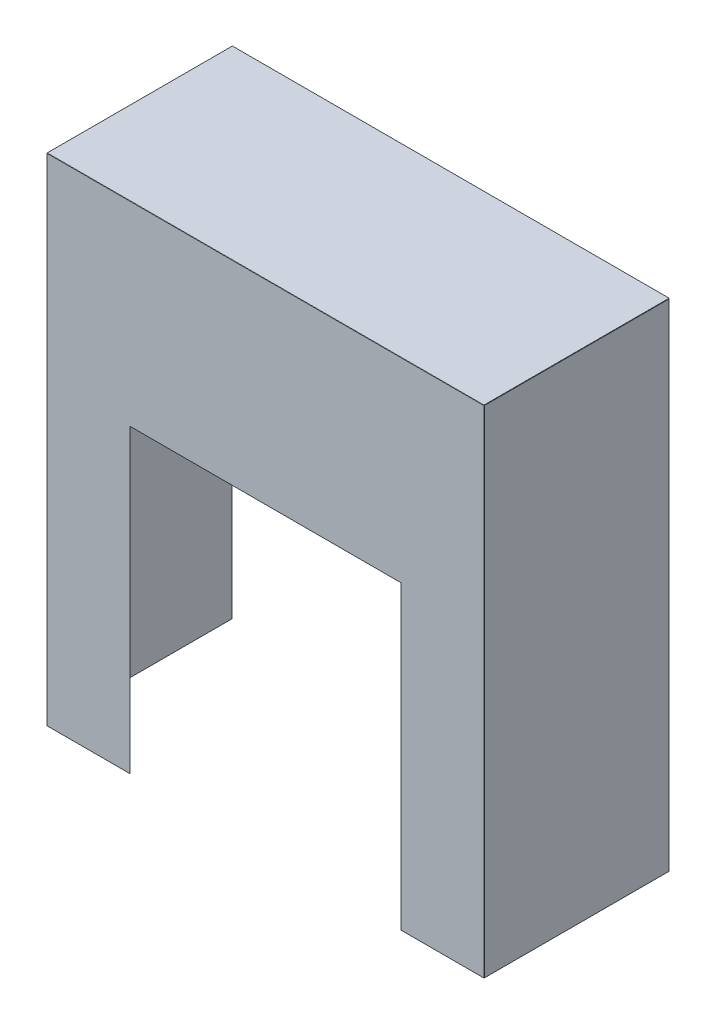
ISO-10303-21;
HEADER;
FILE_DESCRIPTION(('STEP AP214'),'2;1');
FILE_NAME('part.step','',(''),(''),'','','');
FILE_SCHEMA(('AUTOMOTIVE_DESIGN { 1 0 10303 214 1 1 1 1 }'));
ENDSEC;
DATA;
#1=APPLICATION_CONTEXT('core data for automotive mechanical design processes');
#2=APPLICATION_PROTOCOL_DEFINITION('international standard','automotive_design',2000,#1);
#3=PRODUCT_CONTEXT('',#1,'mechanical');
#4=PRODUCT('Part','Part','',(#3));
#5=PRODUCT_RELATED_PRODUCT_CATEGORY('part','',(#4));
#6=PRODUCT_DEFINITION_FORMATION('','',#4);
#7=PRODUCT_DEFINITION_CONTEXT('part definition',#1,'design');
#8=PRODUCT_DEFINITION('design','',#6,#7);
#9=PRODUCT_DEFINITION_SHAPE('','',#8);
#10=(LENGTH_UNIT() NAMED_UNIT(*) SI_UNIT(.MILLI.,.METRE.));
#11=(NAMED_UNIT(*) PLANE_ANGLE_UNIT() SI_UNIT($,.RADIAN.));
#12=(NAMED_UNIT(*) SI_UNIT($,.STERADIAN.) SOLID_ANGLE_UNIT());
#13=UNCERTAINTY_MEASURE_WITH_UNIT(LENGTH_MEASURE(1.E-05),#10,'distance_accuracy_value','');
#14=(GEOMETRIC_REPRESENTATION_CONTEXT(3) GLOBAL_UNCERTAINTY_ASSIGNED_CONTEXT((#13)) GLOBAL_UNIT_ASSIGNED_CONTEXT((#10,
#11,#12)) REPRESENTATION_CONTEXT('',''));
#15=CARTESIAN_POINT('',(0.,0.,0.));
#16=DIRECTION('',(0.,0.,1.));
#17=DIRECTION('',(1.,0.,0.));
#18=AXIS2_PLACEMENT_3D('',#15,#16,#17);
#19=CARTESIAN_POINT('',(-2950.,-3350.,2.00660000001204));
#20=DIRECTION('',(0.,-1.,0.));
#21=DIRECTION('',(0.,0.,-1.));
#22=AXIS2_PLACEMENT_3D('',#19,#20,#21);
#23=PLANE('',#22);
#24=DIRECTION('',(0.,0.,1.));
#25=VECTOR('',#24,1.);
#26=CARTESIAN_POINT('',(-560.599999999999,-3350.,-1250.001));
#27=LINE('',#26,#25);
#28=CARTESIAN_POINT('',(-560.599999999999,-3350.,0.736600000011745));
#29=VERTEX_POINT('',#28);
#30=CARTESIAN_POINT('',(-560.599999999999,-3350.,2.00659999999999));
#31=VERTEX_POINT('',#30);
#32=EDGE_CURVE('E403',#29,#31,#27,.T.);
#33=ORIENTED_EDGE('',*,*,#32,.F.);
#34=DIRECTION('',(1.,0.,0.));
#35=VECTOR('',#34,1.);
#36=CARTESIAN_POINT('',(0.,-3350.,0.736600000011689));
#37=LINE('',#36,#35);
#38=CARTESIAN_POINT('',(0.,-3350.,0.736600000011689));
#39=VERTEX_POINT('',#38);
#40=EDGE_CURVE('E244',#39,#29,#37,.F.);
#41=ORIENTED_EDGE('',*,*,#40,.F.);
#42=DIRECTION('',(0.,0.,-1.));
#43=VECTOR('',#42,1.);
#44=CARTESIAN_POINT('',(0.,-3350.,2.00660000001169));
#45=LINE('',#44,#43);
#46=CARTESIAN_POINT('',(2.12629513171861E-13,-3350.,2.00660000001157));
#47=VERTEX_POINT('',#46);
#48=EDGE_CURVE('E265',#47,#39,#45,.T.);
#49=ORIENTED_EDGE('',*,*,#48,.F.);
#50=DIRECTION('',(-1.,0.,0.));
#51=VECTOR('',#50,1.);
#52=CARTESIAN_POINT('',(-2950.,-3350.,2.00660000001204));
#53=LINE('',#52,#51);
#54=EDGE_CURVE('E257',#47,#31,#53,.T.);
#55=ORIENTED_EDGE('',*,*,#54,.T.);
#56=EDGE_LOOP('',(#33,#41,#49,#55));
#57=FACE_BOUND('',#56,.T.);
#58=ADVANCED_FACE('F102',(#57),#23,.T.);
#59=CARTESIAN_POINT('',(0.,-1.27,0.));
#60=DIRECTION('',(1.,0.,0.));
#61=DIRECTION('',(0.,0.,-1.));
#62=AXIS2_PLACEMENT_3D('',#59,#60,#61);
#63=PLANE('',#62);
#64=DIRECTION('',(0.,0.,-1.));
#65=VECTOR('',#64,1.);
#66=CARTESIAN_POINT('',(0.,0.,0.));
#67=LINE('',#66,#65);
#68=CARTESIAN_POINT('',(0.,0.,0.));
#69=VERTEX_POINT('',#68);
#70=CARTESIAN_POINT('',(0.,0.,-1250.));
#71=VERTEX_POINT('',#70);
#72=EDGE_CURVE('E159',#69,#71,#67,.T.);
#73=ORIENTED_EDGE('',*,*,#72,.F.);
#74=DIRECTION('',(0.,1.,0.));
#75=VECTOR('',#74,1.);
#76=CARTESIAN_POINT('',(0.,-1.27,0.));
#77=LINE('',#76,#75);
#78=CARTESIAN_POINT('',(0.,-1.2699999999998,-2.9610493025748E-13));
#79=VERTEX_POINT('',#78);
#80=EDGE_CURVE('E13',#79,#69,#77,.T.);
#81=ORIENTED_EDGE('',*,*,#80,.F.);
#82=DIRECTION('',(0.,0.,-1.));
#83=VECTOR('',#82,1.);
#84=CARTESIAN_POINT('',(0.,-1.27,0.));
#85=LINE('',#84,#83);
#86=CARTESIAN_POINT('',(0.,-1.27,-1250.));
#87=VERTEX_POINT('',#86);
#88=EDGE_CURVE('E183',#79,#87,#85,.T.);
#89=ORIENTED_EDGE('',*,*,#88,.T.);
#90=DIRECTION('',(0.,1.,0.));
#91=VECTOR('',#90,1.);
#92=CARTESIAN_POINT('',(0.,-1.27,-1250.));
#93=LINE('',#92,#91);
#94=EDGE_CURVE('E106',#87,#71,#93,.T.);
#95=ORIENTED_EDGE('',*,*,#94,.T.);
#96=EDGE_LOOP('',(#73,#81,#89,#95));
#97=FACE_BOUND('',#96,.T.);
#98=ADVANCED_FACE('F104',(#97),#63,.T.);
#99=CARTESIAN_POINT('',(-2950.,-1.27,3.55147571752732E-13));
#100=DIRECTION('',(-1.,0.,0.));
#101=DIRECTION('',(0.,0.,1.));
#102=AXIS2_PLACEMENT_3D('',#99,#100,#101);
#103=PLANE('',#102);
#104=DIRECTION('',(0.,0.,1.));
#105=VECTOR('',#104,1.);
#106=CARTESIAN_POINT('',(-2950.,0.,3.55147571752732E-13));
#107=LINE('',#106,#105);
#108=CARTESIAN_POINT('',(-2950.,0.,-1250.));
#109=VERTEX_POINT('',#108);
#110=CARTESIAN_POINT('',(-2950.,2.05131051034257E-13,0.));
#111=VERTEX_POINT('',#110);
#112=EDGE_CURVE('E181',#109,#111,#107,.T.);
#113=ORIENTED_EDGE('',*,*,#112,.F.);
#114=DIRECTION('',(0.,1.,0.));
#115=VECTOR('',#114,1.);
#116=CARTESIAN_POINT('',(-2950.,-1.27,-1250.));
#117=LINE('',#116,#115);
#118=CARTESIAN_POINT('',(-2950.,-1.27,-1250.));
#119=VERTEX_POINT('',#118);
#120=EDGE_CURVE('E129',#119,#109,#117,.T.);
#121=ORIENTED_EDGE('',*,*,#120,.F.);
#122=DIRECTION('',(0.,0.,1.));
#123=VECTOR('',#122,1.);
#124=CARTESIAN_POINT('',(-2950.,-1.27,3.55147571752732E-13));
#125=LINE('',#124,#123);
#126=CARTESIAN_POINT('',(-2950.,-1.2699999999998,3.55211199697517E-13));
#127=VERTEX_POINT('',#126);
#128=EDGE_CURVE('E201',#119,#127,#125,.T.);
#129=ORIENTED_EDGE('',*,*,#128,.T.);
#130=DIRECTION('',(0.,1.,0.));
#131=VECTOR('',#130,1.);
#132=CARTESIAN_POINT('',(-2950.,-1.27,3.55147571752732E-13));
#133=LINE('',#132,#131);
#134=EDGE_CURVE('E112',#127,#111,#133,.T.);
#135=ORIENTED_EDGE('',*,*,#134,.T.);
#136=EDGE_LOOP('',(#113,#121,#129,#135));
#137=FACE_BOUND('',#136,.T.);
#138=ADVANCED_FACE('F613',(#137),#103,.T.);
#139=CARTESIAN_POINT('',(0.,-1.27,-1250.));
#140=DIRECTION('',(0.,0.,-1.));
#141=DIRECTION('',(-1.,0.,0.));
#142=AXIS2_PLACEMENT_3D('',#139,#140,#141);
#143=PLANE('',#142);
#144=DIRECTION('',(-1.,0.,0.));
#145=VECTOR('',#144,1.);
#146=CARTESIAN_POINT('',(0.,0.,-1250.));
#147=LINE('',#146,#145);
#148=EDGE_CURVE('E177',#71,#109,#147,.T.);
#149=ORIENTED_EDGE('',*,*,#148,.F.);
#150=ORIENTED_EDGE('',*,*,#94,.F.);
#151=DIRECTION('',(-1.,0.,0.));
#152=VECTOR('',#151,1.);
#153=CARTESIAN_POINT('',(0.,-1.27,-1250.));
#154=LINE('',#153,#152);
#155=EDGE_CURVE('E187',#87,#119,#154,.T.);
#156=ORIENTED_EDGE('',*,*,#155,.T.);
#157=ORIENTED_EDGE('',*,*,#120,.T.);
#158=EDGE_LOOP('',(#149,#150,#156,#157));
#159=FACE_BOUND('',#158,.T.);
#160=ADVANCED_FACE('F210',(#159),#143,.T.);
#161=CARTESIAN_POINT('',(0.,-1.27,0.));
#162=DIRECTION('',(0.,1.,0.));
#163=DIRECTION('',(0.,0.,1.));
#164=AXIS2_PLACEMENT_3D('',#161,#162,#163);
#165=PLANE('',#164);
#166=ORIENTED_EDGE('',*,*,#88,.F.);
#167=DIRECTION('',(1.,0.,0.));
#168=VECTOR('',#167,1.);
#169=CARTESIAN_POINT('',(0.,-1.27,0.));
#170=LINE('',#169,#168);
#171=EDGE_CURVE('E198',#127,#79,#170,.T.);
#172=ORIENTED_EDGE('',*,*,#171,.F.);
#173=ORIENTED_EDGE('',*,*,#128,.F.);
#174=ORIENTED_EDGE('',*,*,#155,.F.);
#175=EDGE_LOOP('',(#166,#172,#173,#174));
#176=FACE_BOUND('',#175,.T.);
#177=ADVANCED_FACE('F213',(#176),#165,.F.);
#178=CARTESIAN_POINT('',(0.,0.,0.));
#179=DIRECTION('',(0.,1.,0.));
#180=DIRECTION('',(0.,0.,1.));
#181=AXIS2_PLACEMENT_3D('',#178,#179,#180);
#182=PLANE('',#181);
#183=ORIENTED_EDGE('',*,*,#72,.T.);
#184=ORIENTED_EDGE('',*,*,#148,.T.);
#185=ORIENTED_EDGE('',*,*,#112,.T.);
#186=DIRECTION('',(1.,0.,0.));
#187=VECTOR('',#186,1.);
#188=CARTESIAN_POINT('',(0.,0.,0.));
#189=LINE('',#188,#187);
#190=EDGE_CURVE('E150',#111,#69,#189,.T.);
#191=ORIENTED_EDGE('',*,*,#190,.T.);
#192=EDGE_LOOP('',(#183,#184,#185,#191));
#193=FACE_BOUND('',#192,.T.);
#194=ADVANCED_FACE('F180',(#193),#182,.T.);
#195=CARTESIAN_POINT('',(0.,-2.00659999999994,-1.48011539015749E-13));
#196=DIRECTION('',(1.,0.,0.));
#197=DIRECTION('',(0.,0.,-1.));
#198=AXIS2_PLACEMENT_3D('',#195,#196,#197);
#199=PLANE('',#198);
#200=DIRECTION('',(0.,0.,1.));
#201=VECTOR('',#200,1.);
#202=CARTESIAN_POINT('',(0.,-2.00660000000008,2.00660000001169));
#203=LINE('',#202,#201);
#204=CARTESIAN_POINT('',(0.,-2.00659999999994,0.7366));
#205=VERTEX_POINT('',#204);
#206=CARTESIAN_POINT('',(0.,-2.00659999999994,2.0066));
#207=VERTEX_POINT('',#206);
#208=EDGE_CURVE('E224',#205,#207,#203,.T.);
#209=ORIENTED_EDGE('',*,*,#208,.F.);
#210=CARTESIAN_POINT('',(0.,-2.00659999999994,-1.48011539015749E-13));
#211=DIRECTION('',(-1.,0.,0.));
#212=DIRECTION('',(0.,0.,1.));
#213=AXIS2_PLACEMENT_3D('',#210,#211,#212);
#214=CIRCLE('',#213,0.736600000000148);
#215=EDGE_CURVE('E168',#79,#205,#214,.F.);
#216=ORIENTED_EDGE('',*,*,#215,.F.);
#217=ORIENTED_EDGE('',*,*,#80,.T.);
#218=CARTESIAN_POINT('',(0.,-2.00659999999994,-1.48011539015749E-13));
#219=DIRECTION('',(-1.,0.,0.));
#220=DIRECTION('',(0.,0.,1.));
#221=AXIS2_PLACEMENT_3D('',#218,#219,#220);
#222=CIRCLE('',#221,2.00660000000015);
#223=EDGE_CURVE('E146',#69,#207,#222,.F.);
#224=ORIENTED_EDGE('',*,*,#223,.T.);
#225=EDGE_LOOP('',(#209,#216,#217,#224));
#226=FACE_BOUND('',#225,.T.);
#227=ADVANCED_FACE('F165',(#226),#199,.T.);
#228=CARTESIAN_POINT('',(-2950.,-2.00659999999994,5.03304590939249E-13));
#229=DIRECTION('',(1.,0.,0.));
#230=DIRECTION('',(0.,0.,-1.));
#231=AXIS2_PLACEMENT_3D('',#228,#229,#230);
#232=PLANE('',#231);
#233=CARTESIAN_POINT('',(-2950.,-2.00659999999994,5.03304590939249E-13));
#234=DIRECTION('',(-1.,0.,0.));
#235=DIRECTION('',(0.,0.,1.));
#236=AXIS2_PLACEMENT_3D('',#233,#234,#235);
#237=CIRCLE('',#236,0.736600000000148);
#238=CARTESIAN_POINT('',(-2950.,-2.00659999999994,0.736600000000651));
#239=VERTEX_POINT('',#238);
#240=EDGE_CURVE('E216',#239,#127,#237,.T.);
#241=ORIENTED_EDGE('',*,*,#240,.F.);
#242=DIRECTION('',(0.,0.,1.));
#243=VECTOR('',#242,1.);
#244=CARTESIAN_POINT('',(-2950.,-2.00659999999989,0.736600000000355));
#245=LINE('',#244,#243);
#246=CARTESIAN_POINT('',(-2950.,-2.00660000000004,2.00660000000064));
#247=VERTEX_POINT('',#246);
#248=EDGE_CURVE('E233',#239,#247,#245,.T.);
#249=ORIENTED_EDGE('',*,*,#248,.T.);
#250=CARTESIAN_POINT('',(-2950.,-2.00659999999994,5.03304590939249E-13));
#251=DIRECTION('',(-1.,0.,0.));
#252=DIRECTION('',(0.,0.,1.));
#253=AXIS2_PLACEMENT_3D('',#250,#251,#252);
#254=CIRCLE('',#253,2.00660000000015);
#255=EDGE_CURVE('E160',#247,#111,#254,.T.);
#256=ORIENTED_EDGE('',*,*,#255,.T.);
#257=ORIENTED_EDGE('',*,*,#134,.F.);
#258=EDGE_LOOP('',(#241,#249,#256,#257));
#259=FACE_BOUND('',#258,.T.);
#260=ADVANCED_FACE('F525',(#259),#232,.F.);
#261=CARTESIAN_POINT('',(-2950.,-2.00659999999994,5.03304590939249E-13));
#262=DIRECTION('',(-1.,0.,0.));
#263=DIRECTION('',(0.,0.,1.));
#264=AXIS2_PLACEMENT_3D('',#261,#262,#263);
#265=CYLINDRICAL_SURFACE('',#264,2.00660000000015);
#266=ORIENTED_EDGE('',*,*,#190,.F.);
#267=ORIENTED_EDGE('',*,*,#255,.F.);
#268=DIRECTION('',(-1.,0.,0.));
#269=VECTOR('',#268,1.);
#270=CARTESIAN_POINT('',(0.,-2.0066,2.0066));
#271=LINE('',#270,#269);
#272=EDGE_CURVE('E154',#207,#247,#271,.T.);
#273=ORIENTED_EDGE('',*,*,#272,.F.);
#274=ORIENTED_EDGE('',*,*,#223,.F.);
#275=EDGE_LOOP('',(#266,#267,#273,#274));
#276=FACE_BOUND('',#275,.T.);
#277=ADVANCED_FACE('F147',(#276),#265,.T.);
#278=CARTESIAN_POINT('',(-2950.,-2.00659999999994,5.03304590939249E-13));
#279=DIRECTION('',(-1.,0.,0.));
#280=DIRECTION('',(0.,0.,1.));
#281=AXIS2_PLACEMENT_3D('',#278,#279,#280);
#282=CYLINDRICAL_SURFACE('',#281,0.736600000000148);
#283=ORIENTED_EDGE('',*,*,#171,.T.);
#284=ORIENTED_EDGE('',*,*,#215,.T.);
#285=DIRECTION('',(1.,0.,0.));
#286=VECTOR('',#285,1.);
#287=CARTESIAN_POINT('',(0.,-2.0066,0.7366));
#288=LINE('',#287,#286);
#289=EDGE_CURVE('E228',#205,#239,#288,.F.);
#290=ORIENTED_EDGE('',*,*,#289,.T.);
#291=ORIENTED_EDGE('',*,*,#240,.T.);
#292=EDGE_LOOP('',(#283,#284,#290,#291));
#293=FACE_BOUND('',#292,.T.);
#294=ADVANCED_FACE('F522',(#293),#282,.F.);
#295=CARTESIAN_POINT('',(0.,0.,2.00659999999999));
#296=DIRECTION('',(0.,0.,1.));
#297=DIRECTION('',(0.,-1.,0.));
#298=AXIS2_PLACEMENT_3D('',#295,#296,#297);
#299=PLANE('',#298);
#300=DIRECTION('',(0.,1.,0.));
#301=VECTOR('',#300,1.);
#302=CARTESIAN_POINT('',(-560.599999999999,-3350.,2.00659999999999));
#303=LINE('',#302,#301);
#304=CARTESIAN_POINT('',(-560.6,-1318.,2.00659999999999));
#305=VERTEX_POINT('',#304);
#306=EDGE_CURVE('E423',#31,#305,#303,.T.);
#307=ORIENTED_EDGE('',*,*,#306,.F.);
#308=ORIENTED_EDGE('',*,*,#54,.F.);
#309=DIRECTION('',(0.,-1.,0.));
#310=VECTOR('',#309,1.);
#311=CARTESIAN_POINT('',(0.,-3350.,2.00660000001169));
#312=LINE('',#311,#310);
#313=EDGE_CURVE('E252',#207,#47,#312,.T.);
#314=ORIENTED_EDGE('',*,*,#313,.F.);
#315=ORIENTED_EDGE('',*,*,#272,.T.);
#316=DIRECTION('',(0.,1.,0.));
#317=VECTOR('',#316,1.);
#318=CARTESIAN_POINT('',(-2950.,-1.27,2.00660000000035));
#319=LINE('',#318,#317);
#320=CARTESIAN_POINT('',(-2950.,-3350.,2.00660000001204));
#321=VERTEX_POINT('',#320);
#322=EDGE_CURVE('E261',#321,#247,#319,.T.);
#323=ORIENTED_EDGE('',*,*,#322,.F.);
#324=CARTESIAN_POINT('',(-2389.4,-3350.,2.00660000001198));
#325=VERTEX_POINT('',#324);
#326=EDGE_CURVE('E256',#325,#321,#53,.T.);
#327=ORIENTED_EDGE('',*,*,#326,.F.);
#328=DIRECTION('',(0.,-1.,0.));
#329=VECTOR('',#328,1.);
#330=CARTESIAN_POINT('',(-2389.4,-3350.,2.00659999999999));
#331=LINE('',#330,#329);
#332=CARTESIAN_POINT('',(-2389.4,-1318.,2.00659999999999));
#333=VERTEX_POINT('',#332);
#334=EDGE_CURVE('E120',#333,#325,#331,.T.);
#335=ORIENTED_EDGE('',*,*,#334,.F.);
#336=DIRECTION('',(-1.,0.,0.));
#337=VECTOR('',#336,1.);
#338=CARTESIAN_POINT('',(-560.6,-1318.,2.00659999999999));
#339=LINE('',#338,#337);
#340=EDGE_CURVE('E419',#305,#333,#339,.T.);
#341=ORIENTED_EDGE('',*,*,#340,.F.);
#342=EDGE_LOOP('',(#307,#308,#314,#315,#323,#327,#335,#341));
#343=FACE_BOUND('',#342,.T.);
#344=ADVANCED_FACE('F567',(#343),#299,.T.);
#345=CARTESIAN_POINT('',(0.,0.,0.736599999999993));
#346=DIRECTION('',(0.,0.,1.));
#347=DIRECTION('',(0.,-1.,0.));
#348=AXIS2_PLACEMENT_3D('',#345,#346,#347);
#349=PLANE('',#348);
#350=ORIENTED_EDGE('',*,*,#40,.T.);
#351=DIRECTION('',(0.,-1.,0.));
#352=VECTOR('',#351,1.);
#353=CARTESIAN_POINT('',(-560.599999999999,-3349.99999999999,0.736600000011745));
#354=LINE('',#353,#352);
#355=CARTESIAN_POINT('',(-560.6,-1318.,0.736600000004639));
#356=VERTEX_POINT('',#355);
#357=EDGE_CURVE('E427',#356,#29,#354,.T.);
#358=ORIENTED_EDGE('',*,*,#357,.F.);
#359=DIRECTION('',(1.,0.,0.));
#360=VECTOR('',#359,1.);
#361=CARTESIAN_POINT('',(-560.6,-1318.,0.736600000004639));
#362=LINE('',#361,#360);
#363=CARTESIAN_POINT('',(-2389.4,-1318.,0.736600000004639));
#364=VERTEX_POINT('',#363);
#365=EDGE_CURVE('E357',#364,#356,#362,.T.);
#366=ORIENTED_EDGE('',*,*,#365,.F.);
#367=DIRECTION('',(0.,1.,0.));
#368=VECTOR('',#367,1.);
#369=CARTESIAN_POINT('',(-2389.4,-3349.99999999999,0.736600000011967));
#370=LINE('',#369,#368);
#371=CARTESIAN_POINT('',(-2389.4,-3350.,0.736600000011522));
#372=VERTEX_POINT('',#371);
#373=EDGE_CURVE('E431',#372,#364,#370,.T.);
#374=ORIENTED_EDGE('',*,*,#373,.F.);
#375=CARTESIAN_POINT('',(-2950.,-3350.,0.736600000012045));
#376=VERTEX_POINT('',#375);
#377=EDGE_CURVE('E243',#372,#376,#37,.F.);
#378=ORIENTED_EDGE('',*,*,#377,.T.);
#379=DIRECTION('',(0.,-1.,0.));
#380=VECTOR('',#379,1.);
#381=CARTESIAN_POINT('',(-2950.,0.,0.736600000000348));
#382=LINE('',#381,#380);
#383=EDGE_CURVE('E248',#376,#239,#382,.F.);
#384=ORIENTED_EDGE('',*,*,#383,.T.);
#385=ORIENTED_EDGE('',*,*,#289,.F.);
#386=DIRECTION('',(0.,1.,0.));
#387=VECTOR('',#386,1.);
#388=CARTESIAN_POINT('',(0.,0.,0.736599999999993));
#389=LINE('',#388,#387);
#390=EDGE_CURVE('E239',#205,#39,#389,.F.);
#391=ORIENTED_EDGE('',*,*,#390,.T.);
#392=EDGE_LOOP('',(#350,#358,#366,#374,#378,#384,#385,#391));
#393=FACE_BOUND('',#392,.T.);
#394=ADVANCED_FACE('F447',(#393),#349,.F.);
#395=DIRECTION('',(0.,0.,1.));
#396=VECTOR('',#395,1.);
#397=CARTESIAN_POINT('',(-2389.4,-3350.,-1250.001));
#398=LINE('',#397,#396);
#399=EDGE_CURVE('E411',#372,#325,#398,.T.);
#400=ORIENTED_EDGE('',*,*,#399,.T.);
#401=ORIENTED_EDGE('',*,*,#326,.T.);
#402=DIRECTION('',(0.,0.,-1.));
#403=VECTOR('',#402,1.);
#404=CARTESIAN_POINT('',(-2950.,-3350.,2.00660000001204));
#405=LINE('',#404,#403);
#406=EDGE_CURVE('E219',#321,#376,#405,.T.);
#407=ORIENTED_EDGE('',*,*,#406,.T.);
#408=ORIENTED_EDGE('',*,*,#377,.F.);
#409=EDGE_LOOP('',(#400,#401,#407,#408));
#410=FACE_BOUND('',#409,.T.);
#411=ADVANCED_FACE('F561',(#410),#23,.T.);
#412=CARTESIAN_POINT('',(1.23035228679939E-13,-2.00660000000008,0.));
#413=DIRECTION('',(0.,1.,0.));
#414=DIRECTION('',(0.,0.,1.));
#415=AXIS2_PLACEMENT_3D('',#412,#413,#414);
#416=PLANE('',#415);
#417=DIRECTION('',(1.,0.,0.));
#418=VECTOR('',#417,1.);
#419=CARTESIAN_POINT('',(2.0066,-2.00659999999994,0.));
#420=LINE('',#419,#418);
#421=CARTESIAN_POINT('',(0.7366,-2.00660000000008,0.));
#422=VERTEX_POINT('',#421);
#423=CARTESIAN_POINT('',(2.0066,-2.00660000000008,0.));
#424=VERTEX_POINT('',#423);
#425=EDGE_CURVE('E288',#422,#424,#420,.T.);
#426=ORIENTED_EDGE('',*,*,#425,.F.);
#427=CARTESIAN_POINT('',(1.23035228679939E-13,-2.00660000000008,0.));
#428=DIRECTION('',(0.,-1.,0.));
#429=DIRECTION('',(0.,0.,-1.));
#430=AXIS2_PLACEMENT_3D('',#427,#428,#429);
#431=CIRCLE('',#430,0.736599999999877);
#432=EDGE_CURVE('E276',#205,#422,#431,.F.);
#433=ORIENTED_EDGE('',*,*,#432,.F.);
#434=ORIENTED_EDGE('',*,*,#208,.T.);
#435=CARTESIAN_POINT('',(1.23035228679939E-13,-2.00660000000008,0.));
#436=DIRECTION('',(0.,-1.,0.));
#437=DIRECTION('',(0.,0.,-1.));
#438=AXIS2_PLACEMENT_3D('',#435,#436,#437);
#439=CIRCLE('',#438,2.00659999999988);
#440=EDGE_CURVE('E229',#207,#424,#439,.F.);
#441=ORIENTED_EDGE('',*,*,#440,.T.);
#442=EDGE_LOOP('',(#426,#433,#434,#441));
#443=FACE_BOUND('',#442,.T.);
#444=ADVANCED_FACE('F573',(#443),#416,.T.);
#445=CARTESIAN_POINT('',(-1.23360489331685E-13,-3350.,1.16893406547424E-11));
#446=DIRECTION('',(0.,1.,0.));
#447=DIRECTION('',(0.,0.,1.));
#448=AXIS2_PLACEMENT_3D('',#445,#446,#447);
#449=PLANE('',#448);
#450=CARTESIAN_POINT('',(-1.23360489331685E-13,-3350.,1.16893406547424E-11));
#451=DIRECTION('',(0.,-1.,0.));
#452=DIRECTION('',(0.,0.,-1.));
#453=AXIS2_PLACEMENT_3D('',#450,#451,#452);
#454=CIRCLE('',#453,0.736599999999877);
#455=CARTESIAN_POINT('',(0.736599999999753,-3350.,1.16918238013538E-11));
#456=VERTEX_POINT('',#455);
#457=EDGE_CURVE('E272',#456,#39,#454,.T.);
#458=ORIENTED_EDGE('',*,*,#457,.F.);
#459=DIRECTION('',(1.,0.,0.));
#460=VECTOR('',#459,1.);
#461=CARTESIAN_POINT('',(0.7366,-3350.,1.16918391293236E-11));
#462=LINE('',#461,#460);
#463=CARTESIAN_POINT('',(2.0066,-3350.,1.1714201148346E-11));
#464=VERTEX_POINT('',#463);
#465=EDGE_CURVE('E297',#456,#464,#462,.T.);
#466=ORIENTED_EDGE('',*,*,#465,.T.);
#467=CARTESIAN_POINT('',(-1.23360489331685E-13,-3350.,1.16893406547424E-11));
#468=DIRECTION('',(0.,-1.,0.));
#469=DIRECTION('',(0.,0.,-1.));
#470=AXIS2_PLACEMENT_3D('',#467,#468,#469);
#471=CIRCLE('',#470,2.00659999999988);
#472=EDGE_CURVE('E281',#464,#47,#471,.T.);
#473=ORIENTED_EDGE('',*,*,#472,.T.);
#474=ORIENTED_EDGE('',*,*,#48,.T.);
#475=EDGE_LOOP('',(#458,#466,#473,#474));
#476=FACE_BOUND('',#475,.T.);
#477=ADVANCED_FACE('F622',(#476),#449,.F.);
#478=CARTESIAN_POINT('',(-1.23360489331685E-13,-3350.,1.16893406547424E-11));
#479=DIRECTION('',(0.,-1.,0.));
#480=DIRECTION('',(1.,0.,0.));
#481=AXIS2_PLACEMENT_3D('',#478,#479,#480);
#482=CYLINDRICAL_SURFACE('',#481,2.00659999999988);
#483=ORIENTED_EDGE('',*,*,#313,.T.);
#484=ORIENTED_EDGE('',*,*,#472,.F.);
#485=DIRECTION('',(0.,-1.,0.));
#486=VECTOR('',#485,1.);
#487=CARTESIAN_POINT('',(2.0066,-2.00660000000212,0.));
#488=LINE('',#487,#486);
#489=EDGE_CURVE('E301',#464,#424,#488,.F.);
#490=ORIENTED_EDGE('',*,*,#489,.T.);
#491=ORIENTED_EDGE('',*,*,#440,.F.);
#492=EDGE_LOOP('',(#483,#484,#490,#491));
#493=FACE_BOUND('',#492,.T.);
#494=ADVANCED_FACE('F574',(#493),#482,.T.);
#495=CARTESIAN_POINT('',(-1.23360489331685E-13,-3350.,1.16893406547424E-11));
#496=DIRECTION('',(0.,-1.,0.));
#497=DIRECTION('',(1.,0.,0.));
#498=AXIS2_PLACEMENT_3D('',#495,#496,#497);
#499=CYLINDRICAL_SURFACE('',#498,0.736599999999877);
#500=ORIENTED_EDGE('',*,*,#390,.F.);
#501=ORIENTED_EDGE('',*,*,#432,.T.);
#502=DIRECTION('',(0.,-1.,0.));
#503=VECTOR('',#502,1.);
#504=CARTESIAN_POINT('',(0.7366,-2.00660000000212,0.));
#505=LINE('',#504,#503);
#506=EDGE_CURVE('E292',#422,#456,#505,.T.);
#507=ORIENTED_EDGE('',*,*,#506,.T.);
#508=ORIENTED_EDGE('',*,*,#457,.T.);
#509=EDGE_LOOP('',(#500,#501,#507,#508));
#510=FACE_BOUND('',#509,.T.);
#511=ADVANCED_FACE('F594',(#510),#499,.F.);
#512=CARTESIAN_POINT('',(2.0066,-2.00659999999994,0.736600000000004));
#513=DIRECTION('',(0.,1.,0.));
#514=DIRECTION('',(0.,0.,1.));
#515=AXIS2_PLACEMENT_3D('',#512,#513,#514);
#516=PLANE('',#515);
#517=DIRECTION('',(0.,0.,-1.));
#518=VECTOR('',#517,1.);
#519=CARTESIAN_POINT('',(0.7366,-2.00659999999994,0.));
#520=LINE('',#519,#518);
#521=CARTESIAN_POINT('',(0.736600000004207,-2.0066000000043,-1247.9934));
#522=VERTEX_POINT('',#521);
#523=EDGE_CURVE('E305',#422,#522,#520,.T.);
#524=ORIENTED_EDGE('',*,*,#523,.F.);
#525=ORIENTED_EDGE('',*,*,#425,.T.);
#526=DIRECTION('',(0.,0.,1.));
#527=VECTOR('',#526,1.);
#528=CARTESIAN_POINT('',(2.0066,-2.00659999999994,0.736600000000004));
#529=LINE('',#528,#527);
#530=CARTESIAN_POINT('',(2.00660000000421,-2.0066000000043,-1247.9934));
#531=VERTEX_POINT('',#530);
#532=EDGE_CURVE('E317',#424,#531,#529,.F.);
#533=ORIENTED_EDGE('',*,*,#532,.T.);
#534=DIRECTION('',(-1.,0.,0.));
#535=VECTOR('',#534,1.);
#536=CARTESIAN_POINT('',(2.00660000000421,-2.0066000000043,-1247.9934));
#537=LINE('',#536,#535);
#538=EDGE_CURVE('E329',#531,#522,#537,.T.);
#539=ORIENTED_EDGE('',*,*,#538,.T.);
#540=EDGE_LOOP('',(#524,#525,#533,#539));
#541=FACE_BOUND('',#540,.T.);
#542=ADVANCED_FACE('F591',(#541),#516,.T.);
#543=CARTESIAN_POINT('',(2.00660000000421,-3350.,-1247.99339999999));
#544=DIRECTION('',(0.,-1.,0.));
#545=DIRECTION('',(0.,0.,-1.));
#546=AXIS2_PLACEMENT_3D('',#543,#544,#545);
#547=PLANE('',#546);
#548=DIRECTION('',(0.,0.,-1.));
#549=VECTOR('',#548,1.);
#550=CARTESIAN_POINT('',(2.00660000000421,-3350.,-1247.99339999999));
#551=LINE('',#550,#549);
#552=CARTESIAN_POINT('',(2.00660000000421,-3350.,-1247.99339999999));
#553=VERTEX_POINT('',#552);
#554=EDGE_CURVE('E325',#553,#464,#551,.F.);
#555=ORIENTED_EDGE('',*,*,#554,.T.);
#556=ORIENTED_EDGE('',*,*,#465,.F.);
#557=DIRECTION('',(0.,0.,1.));
#558=VECTOR('',#557,1.);
#559=CARTESIAN_POINT('',(0.7366,-3350.,1.19136064596993E-11));
#560=LINE('',#559,#558);
#561=CARTESIAN_POINT('',(0.736600000004207,-3350.,-1247.99339999999));
#562=VERTEX_POINT('',#561);
#563=EDGE_CURVE('E313',#562,#456,#560,.T.);
#564=ORIENTED_EDGE('',*,*,#563,.F.);
#565=DIRECTION('',(-1.,0.,0.));
#566=VECTOR('',#565,1.);
#567=CARTESIAN_POINT('',(2.00660000000421,-3350.,-1247.99339999999));
#568=LINE('',#567,#566);
#569=EDGE_CURVE('E277',#553,#562,#568,.T.);
#570=ORIENTED_EDGE('',*,*,#569,.F.);
#571=EDGE_LOOP('',(#555,#556,#564,#570));
#572=FACE_BOUND('',#571,.T.);
#573=ADVANCED_FACE('F583',(#572),#547,.T.);
#574=CARTESIAN_POINT('',(2.0066,0.,0.));
#575=DIRECTION('',(-1.,0.,0.));
#576=DIRECTION('',(0.,0.,1.));
#577=AXIS2_PLACEMENT_3D('',#574,#575,#576);
#578=PLANE('',#577);
#579=ORIENTED_EDGE('',*,*,#489,.F.);
#580=ORIENTED_EDGE('',*,*,#554,.F.);
#581=DIRECTION('',(0.,1.,0.));
#582=VECTOR('',#581,1.);
#583=CARTESIAN_POINT('',(2.00660000000421,-2.0066000000043,-1247.9934));
#584=LINE('',#583,#582);
#585=EDGE_CURVE('E321',#531,#553,#584,.F.);
#586=ORIENTED_EDGE('',*,*,#585,.F.);
#587=ORIENTED_EDGE('',*,*,#532,.F.);
#588=EDGE_LOOP('',(#579,#580,#586,#587));
#589=FACE_BOUND('',#588,.T.);
#590=ADVANCED_FACE('F579',(#589),#578,.F.);
#591=CARTESIAN_POINT('',(0.7366,0.,0.));
#592=DIRECTION('',(-1.,0.,0.));
#593=DIRECTION('',(0.,0.,1.));
#594=AXIS2_PLACEMENT_3D('',#591,#592,#593);
#595=PLANE('',#594);
#596=ORIENTED_EDGE('',*,*,#563,.T.);
#597=ORIENTED_EDGE('',*,*,#506,.F.);
#598=ORIENTED_EDGE('',*,*,#523,.T.);
#599=DIRECTION('',(0.,-1.,0.));
#600=VECTOR('',#599,1.);
#601=CARTESIAN_POINT('',(0.736600000004207,-4.38675912910636E-12,-1247.9934));
#602=LINE('',#601,#600);
#603=EDGE_CURVE('E309',#522,#562,#602,.T.);
#604=ORIENTED_EDGE('',*,*,#603,.T.);
#605=EDGE_LOOP('',(#596,#597,#598,#604));
#606=FACE_BOUND('',#605,.T.);
#607=ADVANCED_FACE('F597',(#606),#595,.T.);
#608=CARTESIAN_POINT('',(2.00660000000421,-2.0066000000043,-1247.9934));
#609=DIRECTION('',(0.,0.,-1.));
#610=DIRECTION('',(0.,1.,0.));
#611=AXIS2_PLACEMENT_3D('',#608,#609,#610);
#612=PLANE('',#611);
#613=ORIENTED_EDGE('',*,*,#603,.F.);
#614=ORIENTED_EDGE('',*,*,#538,.F.);
#615=ORIENTED_EDGE('',*,*,#585,.T.);
#616=ORIENTED_EDGE('',*,*,#569,.T.);
#617=EDGE_LOOP('',(#613,#614,#615,#616));
#618=FACE_BOUND('',#617,.T.);
#619=ADVANCED_FACE('F587',(#618),#612,.T.);
#620=CARTESIAN_POINT('',(-2950.,-3350.,1.19878353118573E-11));
#621=DIRECTION('',(0.,-1.,0.));
#622=DIRECTION('',(0.,0.,-1.));
#623=AXIS2_PLACEMENT_3D('',#620,#621,#622);
#624=PLANE('',#623);
#625=DIRECTION('',(-1.,0.,0.));
#626=VECTOR('',#625,1.);
#627=CARTESIAN_POINT('',(-2952.0066,-3350.,1.19950707352934E-11));
#628=LINE('',#627,#626);
#629=CARTESIAN_POINT('',(-2950.7366,-3350.,1.1990454902257E-11));
#630=VERTEX_POINT('',#629);
#631=CARTESIAN_POINT('',(-2952.0066,-3350.,1.19949714374288E-11));
#632=VERTEX_POINT('',#631);
#633=EDGE_CURVE('E352',#630,#632,#628,.T.);
#634=ORIENTED_EDGE('',*,*,#633,.F.);
#635=CARTESIAN_POINT('',(-2950.,-3350.,1.19878353118573E-11));
#636=DIRECTION('',(0.,1.,0.));
#637=DIRECTION('',(0.,0.,1.));
#638=AXIS2_PLACEMENT_3D('',#635,#636,#637);
#639=CIRCLE('',#638,0.736600000000198);
#640=EDGE_CURVE('E340',#376,#630,#639,.F.);
#641=ORIENTED_EDGE('',*,*,#640,.F.);
#642=ORIENTED_EDGE('',*,*,#406,.F.);
#643=CARTESIAN_POINT('',(-2950.,-3350.,1.19878353118573E-11));
#644=DIRECTION('',(0.,1.,0.));
#645=DIRECTION('',(0.,0.,1.));
#646=AXIS2_PLACEMENT_3D('',#643,#644,#645);
#647=CIRCLE('',#646,2.0066000000002);
#648=EDGE_CURVE('E293',#321,#632,#647,.F.);
#649=ORIENTED_EDGE('',*,*,#648,.T.);
#650=EDGE_LOOP('',(#634,#641,#642,#649));
#651=FACE_BOUND('',#650,.T.);
#652=ADVANCED_FACE('F559',(#651),#624,.T.);
#653=CARTESIAN_POINT('',(-2950.,-2.00660000000005,4.41515855755279E-13));
#654=DIRECTION('',(0.,-1.,0.));
#655=DIRECTION('',(0.,0.,-1.));
#656=AXIS2_PLACEMENT_3D('',#653,#654,#655);
#657=PLANE('',#656);
#658=CARTESIAN_POINT('',(-2950.,-2.00660000000005,4.41515855755279E-13));
#659=DIRECTION('',(0.,1.,0.));
#660=DIRECTION('',(0.,0.,1.));
#661=AXIS2_PLACEMENT_3D('',#658,#659,#660);
#662=CIRCLE('',#661,0.736600000000198);
#663=CARTESIAN_POINT('',(-2950.7366,-2.00660000000005,4.4413544615493E-13));
#664=VERTEX_POINT('',#663);
#665=EDGE_CURVE('E336',#664,#239,#662,.T.);
#666=ORIENTED_EDGE('',*,*,#665,.F.);
#667=DIRECTION('',(-1.,0.,0.));
#668=VECTOR('',#667,1.);
#669=CARTESIAN_POINT('',(-2950.7366,-2.00660000000008,4.44177888392894E-13));
#670=LINE('',#669,#668);
#671=CARTESIAN_POINT('',(-2952.0066,-2.00660000000005,4.47598002340053E-13));
#672=VERTEX_POINT('',#671);
#673=EDGE_CURVE('E361',#664,#672,#670,.T.);
#674=ORIENTED_EDGE('',*,*,#673,.T.);
#675=CARTESIAN_POINT('',(-2950.,-2.00660000000005,4.41515855755279E-13));
#676=DIRECTION('',(0.,1.,0.));
#677=DIRECTION('',(0.,0.,1.));
#678=AXIS2_PLACEMENT_3D('',#675,#676,#677);
#679=CIRCLE('',#678,2.0066000000002);
#680=EDGE_CURVE('E345',#672,#247,#679,.T.);
#681=ORIENTED_EDGE('',*,*,#680,.T.);
#682=ORIENTED_EDGE('',*,*,#248,.F.);
#683=EDGE_LOOP('',(#666,#674,#681,#682));
#684=FACE_BOUND('',#683,.T.);
#685=ADVANCED_FACE('F532',(#684),#657,.F.);
#686=CARTESIAN_POINT('',(-2950.,-2.00660000000008,4.41515855755279E-13));
#687=DIRECTION('',(0.,1.,0.));
#688=DIRECTION('',(-1.,0.,0.));
#689=AXIS2_PLACEMENT_3D('',#686,#687,#688);
#690=CYLINDRICAL_SURFACE('',#689,2.0066000000002);
#691=ORIENTED_EDGE('',*,*,#322,.T.);
#692=ORIENTED_EDGE('',*,*,#680,.F.);
#693=DIRECTION('',(0.,1.,0.));
#694=VECTOR('',#693,1.);
#695=CARTESIAN_POINT('',(-2952.0066,-3350.,1.19950870559384E-11));
#696=LINE('',#695,#694);
#697=EDGE_CURVE('E365',#672,#632,#696,.F.);
#698=ORIENTED_EDGE('',*,*,#697,.T.);
#699=ORIENTED_EDGE('',*,*,#648,.F.);
#700=EDGE_LOOP('',(#691,#692,#698,#699));
#701=FACE_BOUND('',#700,.T.);
#702=ADVANCED_FACE('F556',(#701),#690,.T.);
#703=CARTESIAN_POINT('',(-2950.,-2.00660000000008,4.41515855755279E-13));
#704=DIRECTION('',(0.,1.,0.));
#705=DIRECTION('',(-1.,0.,0.));
#706=AXIS2_PLACEMENT_3D('',#703,#704,#705);
#707=CYLINDRICAL_SURFACE('',#706,0.736600000000198);
#708=ORIENTED_EDGE('',*,*,#383,.F.);
#709=ORIENTED_EDGE('',*,*,#640,.T.);
#710=DIRECTION('',(0.,1.,0.));
#711=VECTOR('',#710,1.);
#712=CARTESIAN_POINT('',(-2950.7366,-3350.,1.19904973444945E-11));
#713=LINE('',#712,#711);
#714=EDGE_CURVE('E356',#630,#664,#713,.T.);
#715=ORIENTED_EDGE('',*,*,#714,.T.);
#716=ORIENTED_EDGE('',*,*,#665,.T.);
#717=EDGE_LOOP('',(#708,#709,#715,#716));
#718=FACE_BOUND('',#717,.T.);
#719=ADVANCED_FACE('F534',(#718),#707,.F.);
#720=CARTESIAN_POINT('',(-2952.0066,-3350.,0.736600000012049));
#721=DIRECTION('',(0.,-1.,0.));
#722=DIRECTION('',(0.,0.,-1.));
#723=AXIS2_PLACEMENT_3D('',#720,#721,#722);
#724=PLANE('',#723);
#725=DIRECTION('',(0.,0.,-1.));
#726=VECTOR('',#725,1.);
#727=CARTESIAN_POINT('',(-2950.7366,-3350.,2.24049481922519E-11));
#728=LINE('',#727,#726);
#729=CARTESIAN_POINT('',(-2950.7366,-3350.,-1247.99339999999));
#730=VERTEX_POINT('',#729);
#731=EDGE_CURVE('E369',#630,#730,#728,.T.);
#732=ORIENTED_EDGE('',*,*,#731,.F.);
#733=ORIENTED_EDGE('',*,*,#633,.T.);
#734=DIRECTION('',(0.,0.,1.));
#735=VECTOR('',#734,1.);
#736=CARTESIAN_POINT('',(-2952.0066,-3350.,0.736600000012049));
#737=LINE('',#736,#735);
#738=CARTESIAN_POINT('',(-2952.0066,-3350.,-1247.99339999999));
#739=VERTEX_POINT('',#738);
#740=EDGE_CURVE('E381',#632,#739,#737,.F.);
#741=ORIENTED_EDGE('',*,*,#740,.T.);
#742=DIRECTION('',(1.,0.,0.));
#743=VECTOR('',#742,1.);
#744=CARTESIAN_POINT('',(-2952.0066,-3350.,-1247.99339999999));
#745=LINE('',#744,#743);
#746=EDGE_CURVE('E393',#739,#730,#745,.T.);
#747=ORIENTED_EDGE('',*,*,#746,.T.);
#748=EDGE_LOOP('',(#732,#733,#741,#747));
#749=FACE_BOUND('',#748,.T.);
#750=ADVANCED_FACE('F541',(#749),#724,.T.);
#751=CARTESIAN_POINT('',(-2952.0066,-2.00660000000437,-1247.9934));
#752=DIRECTION('',(0.,1.,0.));
#753=DIRECTION('',(0.,0.,1.));
#754=AXIS2_PLACEMENT_3D('',#751,#752,#753);
#755=PLANE('',#754);
#756=DIRECTION('',(0.,0.,-1.));
#757=VECTOR('',#756,1.);
#758=CARTESIAN_POINT('',(-2952.0066,-2.00660000000437,-1247.9934));
#759=LINE('',#758,#757);
#760=CARTESIAN_POINT('',(-2952.0066,-2.00660000000448,-1247.9934));
#761=VERTEX_POINT('',#760);
#762=EDGE_CURVE('E389',#761,#672,#759,.F.);
#763=ORIENTED_EDGE('',*,*,#762,.T.);
#764=ORIENTED_EDGE('',*,*,#673,.F.);
#765=DIRECTION('',(0.,0.,1.));
#766=VECTOR('',#765,1.);
#767=CARTESIAN_POINT('',(-2950.7366,-2.00659999999994,1.04983675760761E-11));
#768=LINE('',#767,#766);
#769=CARTESIAN_POINT('',(-2950.7366,-2.00660000000444,-1247.9934));
#770=VERTEX_POINT('',#769);
#771=EDGE_CURVE('E377',#770,#664,#768,.T.);
#772=ORIENTED_EDGE('',*,*,#771,.F.);
#773=DIRECTION('',(1.,0.,0.));
#774=VECTOR('',#773,1.);
#775=CARTESIAN_POINT('',(-2952.0066,-2.00660000000452,-1247.9934));
#776=LINE('',#775,#774);
#777=EDGE_CURVE('E341',#761,#770,#776,.T.);
#778=ORIENTED_EDGE('',*,*,#777,.F.);
#779=EDGE_LOOP('',(#763,#764,#772,#778));
#780=FACE_BOUND('',#779,.T.);
#781=ADVANCED_FACE('F550',(#780),#755,.T.);
#782=CARTESIAN_POINT('',(-2952.0066,0.,1.04958401293495E-11));
#783=DIRECTION('',(1.,0.,0.));
#784=DIRECTION('',(0.,0.,-1.));
#785=AXIS2_PLACEMENT_3D('',#782,#783,#784);
#786=PLANE('',#785);
#787=ORIENTED_EDGE('',*,*,#697,.F.);
#788=ORIENTED_EDGE('',*,*,#762,.F.);
#789=DIRECTION('',(0.,-1.,0.));
#790=VECTOR('',#789,1.);
#791=CARTESIAN_POINT('',(-2952.0066,-3350.,-1247.99339999999));
#792=LINE('',#791,#790);
#793=EDGE_CURVE('E385',#739,#761,#792,.F.);
#794=ORIENTED_EDGE('',*,*,#793,.F.);
#795=ORIENTED_EDGE('',*,*,#740,.F.);
#796=EDGE_LOOP('',(#787,#788,#794,#795));
#797=FACE_BOUND('',#796,.T.);
#798=ADVANCED_FACE('F553',(#797),#786,.F.);
#799=CARTESIAN_POINT('',(-2950.7366,0.,1.04912530540098E-11));
#800=DIRECTION('',(1.,0.,0.));
#801=DIRECTION('',(0.,0.,-1.));
#802=AXIS2_PLACEMENT_3D('',#799,#800,#801);
#803=PLANE('',#802);
#804=ORIENTED_EDGE('',*,*,#771,.T.);
#805=ORIENTED_EDGE('',*,*,#714,.F.);
#806=ORIENTED_EDGE('',*,*,#731,.T.);
#807=DIRECTION('',(0.,1.,0.));
#808=VECTOR('',#807,1.);
#809=CARTESIAN_POINT('',(-2950.7366,-4.22122106753686E-12,-1247.9934));
#810=LINE('',#809,#808);
#811=EDGE_CURVE('E373',#730,#770,#810,.T.);
#812=ORIENTED_EDGE('',*,*,#811,.T.);
#813=EDGE_LOOP('',(#804,#805,#806,#812));
#814=FACE_BOUND('',#813,.T.);
#815=ADVANCED_FACE('F538',(#814),#803,.T.);
#816=CARTESIAN_POINT('',(-2952.0066,-3350.,-1247.99339999999));
#817=DIRECTION('',(0.,0.,-1.));
#818=DIRECTION('',(-1.,0.,0.));
#819=AXIS2_PLACEMENT_3D('',#816,#817,#818);
#820=PLANE('',#819);
#821=ORIENTED_EDGE('',*,*,#811,.F.);
#822=ORIENTED_EDGE('',*,*,#746,.F.);
#823=ORIENTED_EDGE('',*,*,#793,.T.);
#824=ORIENTED_EDGE('',*,*,#777,.T.);
#825=EDGE_LOOP('',(#821,#822,#823,#824));
#826=FACE_BOUND('',#825,.T.);
#827=ADVANCED_FACE('F547',(#826),#820,.T.);
#828=CARTESIAN_POINT('',(-560.599999999999,-3350.,-1250.001));
#829=DIRECTION('',(1.,0.,0.));
#830=DIRECTION('',(0.,1.,0.));
#831=AXIS2_PLACEMENT_3D('',#828,#829,#830);
#832=PLANE('',#831);
#833=ORIENTED_EDGE('',*,*,#357,.T.);
#834=ORIENTED_EDGE('',*,*,#32,.T.);
#835=ORIENTED_EDGE('',*,*,#306,.T.);
#836=DIRECTION('',(0.,0.,1.));
#837=VECTOR('',#836,1.);
#838=CARTESIAN_POINT('',(-560.6,-1318.,-1250.001));
#839=LINE('',#838,#837);
#840=EDGE_CURVE('E404',#356,#305,#839,.T.);
#841=ORIENTED_EDGE('',*,*,#840,.F.);
#842=EDGE_LOOP('',(#833,#834,#835,#841));
#843=FACE_BOUND('',#842,.T.);
#844=ADVANCED_FACE('F762',(#843),#832,.F.);
#845=CARTESIAN_POINT('',(-2389.4,-3350.,-1250.001));
#846=DIRECTION('',(-1.,0.,0.));
#847=DIRECTION('',(0.,0.,1.));
#848=AXIS2_PLACEMENT_3D('',#845,#846,#847);
#849=PLANE('',#848);
#850=ORIENTED_EDGE('',*,*,#373,.T.);
#851=DIRECTION('',(0.,0.,1.));
#852=VECTOR('',#851,1.);
#853=CARTESIAN_POINT('',(-2389.4,-1318.,-1250.001));
#854=LINE('',#853,#852);
#855=EDGE_CURVE('E408',#364,#333,#854,.T.);
#856=ORIENTED_EDGE('',*,*,#855,.T.);
#857=ORIENTED_EDGE('',*,*,#334,.T.);
#858=ORIENTED_EDGE('',*,*,#399,.F.);
#859=EDGE_LOOP('',(#850,#856,#857,#858));
#860=FACE_BOUND('',#859,.T.);
#861=ADVANCED_FACE('F437',(#860),#849,.F.);
#862=CARTESIAN_POINT('',(-560.6,-1318.,-1250.001));
#863=DIRECTION('',(0.,1.,0.));
#864=DIRECTION('',(-1.,0.,0.));
#865=AXIS2_PLACEMENT_3D('',#862,#863,#864);
#866=PLANE('',#865);
#867=ORIENTED_EDGE('',*,*,#365,.T.);
#868=ORIENTED_EDGE('',*,*,#840,.T.);
#869=ORIENTED_EDGE('',*,*,#340,.T.);
#870=ORIENTED_EDGE('',*,*,#855,.F.);
#871=EDGE_LOOP('',(#867,#868,#869,#870));
#872=FACE_BOUND('',#871,.T.);
#873=ADVANCED_FACE('F450',(#872),#866,.F.);
#874=CLOSED_SHELL('',(#58,#98,#138,#160,#177,#194,#227,#260,#277,#294,#344,#394,#411,#444,#477,
#494,#511,#542,#573,#590,#607,#619,#652,#685,#702,#719,#750,#781,#798,#815,#827,#844,#861,#873));
#875=MANIFOLD_SOLID_BREP('B2',#874);
#876=ADVANCED_BREP_SHAPE_REPRESENTATION('',(#18,#875),#14);
#877=SHAPE_DEFINITION_REPRESENTATION(#9,#876);
ENDSEC;
END-ISO-10303-21;
